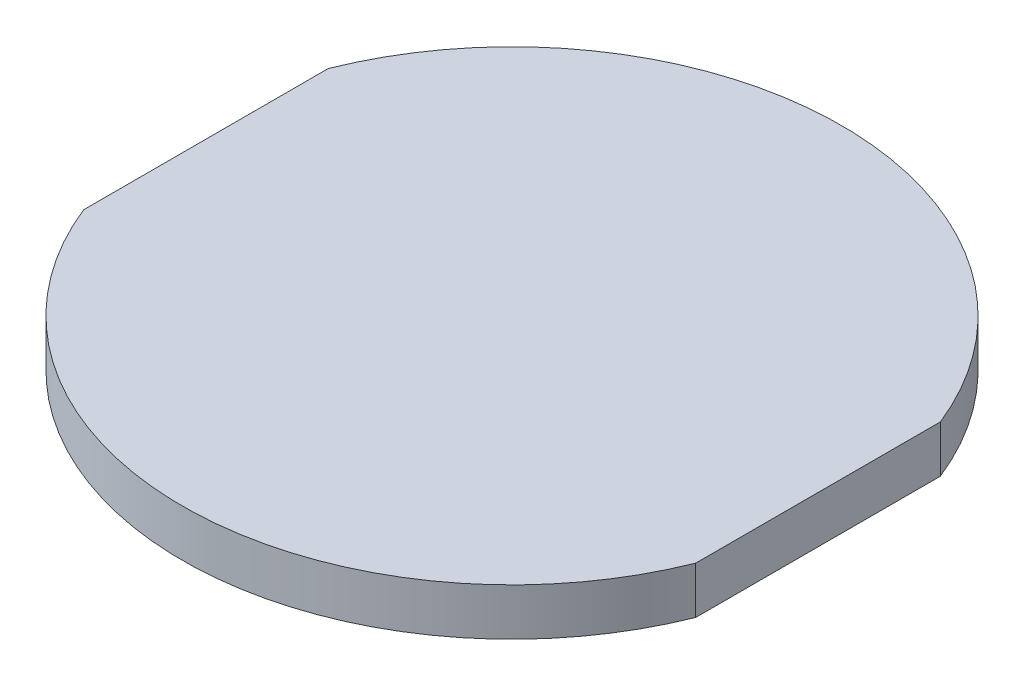
ISO-10303-21;
HEADER;
FILE_DESCRIPTION(('STEP AP214'),'2;1');
FILE_NAME('part.step','',(''),(''),'','','');
FILE_SCHEMA(('AUTOMOTIVE_DESIGN { 1 0 10303 214 1 1 1 1 }'));
ENDSEC;
DATA;
#1=APPLICATION_CONTEXT('core data for automotive mechanical design processes');
#2=APPLICATION_PROTOCOL_DEFINITION('international standard','automotive_design',2000,#1);
#3=PRODUCT_CONTEXT('',#1,'mechanical');
#4=PRODUCT('Part','Part','',(#3));
#5=PRODUCT_RELATED_PRODUCT_CATEGORY('part','',(#4));
#6=PRODUCT_DEFINITION_FORMATION('','',#4);
#7=PRODUCT_DEFINITION_CONTEXT('part definition',#1,'design');
#8=PRODUCT_DEFINITION('design','',#6,#7);
#9=PRODUCT_DEFINITION_SHAPE('','',#8);
#10=(LENGTH_UNIT() NAMED_UNIT(*) SI_UNIT(.MILLI.,.METRE.));
#11=(NAMED_UNIT(*) PLANE_ANGLE_UNIT() SI_UNIT($,.RADIAN.));
#12=(NAMED_UNIT(*) SI_UNIT($,.STERADIAN.) SOLID_ANGLE_UNIT());
#13=UNCERTAINTY_MEASURE_WITH_UNIT(LENGTH_MEASURE(1.E-05),#10,'distance_accuracy_value','');
#14=(GEOMETRIC_REPRESENTATION_CONTEXT(3) GLOBAL_UNCERTAINTY_ASSIGNED_CONTEXT((#13)) GLOBAL_UNIT_ASSIGNED_CONTEXT((#10,
#11,#12)) REPRESENTATION_CONTEXT('',''));
#15=CARTESIAN_POINT('',(0.,0.,0.));
#16=DIRECTION('',(0.,0.,1.));
#17=DIRECTION('',(1.,0.,0.));
#18=AXIS2_PLACEMENT_3D('',#15,#16,#17);
#19=CARTESIAN_POINT('',(0.,1.,0.));
#20=DIRECTION('',(0.,-1.,0.));
#21=DIRECTION('',(0.,0.,-1.));
#22=AXIS2_PLACEMENT_3D('',#19,#20,#21);
#23=CYLINDRICAL_SURFACE('',#22,7.);
#24=CARTESIAN_POINT('',(0.,0.,0.));
#25=DIRECTION('',(0.,1.,0.));
#26=DIRECTION('',(0.,0.,1.));
#27=AXIS2_PLACEMENT_3D('',#24,#25,#26);
#28=CIRCLE('',#27,7.);
#29=CARTESIAN_POINT('',(6.5,0.,-2.59807621135331));
#30=VERTEX_POINT('',#29);
#31=CARTESIAN_POINT('',(-6.5,0.,-2.59807621135332));
#32=VERTEX_POINT('',#31);
#33=EDGE_CURVE('E96',#30,#32,#28,.T.);
#34=ORIENTED_EDGE('',*,*,#33,.T.);
#35=DIRECTION('',(0.,-1.,0.));
#36=VECTOR('',#35,1.);
#37=CARTESIAN_POINT('',(-6.5,1.,-2.59807621135332));
#38=LINE('',#37,#36);
#39=CARTESIAN_POINT('',(-6.5,1.,-2.59807621135332));
#40=VERTEX_POINT('',#39);
#41=EDGE_CURVE('E11',#40,#32,#38,.T.);
#42=ORIENTED_EDGE('',*,*,#41,.F.);
#43=CARTESIAN_POINT('',(0.,1.,0.));
#44=DIRECTION('',(0.,1.,0.));
#45=DIRECTION('',(0.,0.,1.));
#46=AXIS2_PLACEMENT_3D('',#43,#44,#45);
#47=CIRCLE('',#46,7.);
#48=CARTESIAN_POINT('',(6.5,1.,-2.59807621135331));
#49=VERTEX_POINT('',#48);
#50=EDGE_CURVE('E84',#49,#40,#47,.T.);
#51=ORIENTED_EDGE('',*,*,#50,.F.);
#52=DIRECTION('',(0.,-1.,0.));
#53=VECTOR('',#52,1.);
#54=CARTESIAN_POINT('',(6.5,1.,-2.59807621135331));
#55=LINE('',#54,#53);
#56=EDGE_CURVE('E92',#49,#30,#55,.T.);
#57=ORIENTED_EDGE('',*,*,#56,.T.);
#58=EDGE_LOOP('',(#34,#42,#51,#57));
#59=FACE_BOUND('',#58,.T.);
#60=ADVANCED_FACE('F33',(#59),#23,.T.);
#61=CARTESIAN_POINT('',(-6.5,1.,-2.59807621135332));
#62=DIRECTION('',(1.,0.,0.));
#63=DIRECTION('',(0.,0.,-1.));
#64=AXIS2_PLACEMENT_3D('',#61,#62,#63);
#65=PLANE('',#64);
#66=DIRECTION('',(0.,0.,1.));
#67=VECTOR('',#66,1.);
#68=CARTESIAN_POINT('',(-6.5,0.,-2.59807621135332));
#69=LINE('',#68,#67);
#70=CARTESIAN_POINT('',(-6.5,0.,2.59807621135332));
#71=VERTEX_POINT('',#70);
#72=EDGE_CURVE('E88',#32,#71,#69,.T.);
#73=ORIENTED_EDGE('',*,*,#72,.T.);
#74=DIRECTION('',(0.,-1.,0.));
#75=VECTOR('',#74,1.);
#76=CARTESIAN_POINT('',(-6.5,1.,2.59807621135332));
#77=LINE('',#76,#75);
#78=CARTESIAN_POINT('',(-6.5,1.,2.59807621135332));
#79=VERTEX_POINT('',#78);
#80=EDGE_CURVE('E41',#79,#71,#77,.T.);
#81=ORIENTED_EDGE('',*,*,#80,.F.);
#82=DIRECTION('',(0.,0.,1.));
#83=VECTOR('',#82,1.);
#84=CARTESIAN_POINT('',(-6.5,1.,-2.59807621135332));
#85=LINE('',#84,#83);
#86=EDGE_CURVE('E79',#40,#79,#85,.T.);
#87=ORIENTED_EDGE('',*,*,#86,.F.);
#88=ORIENTED_EDGE('',*,*,#41,.T.);
#89=EDGE_LOOP('',(#73,#81,#87,#88));
#90=FACE_BOUND('',#89,.T.);
#91=ADVANCED_FACE('F87',(#90),#65,.F.);
#92=CARTESIAN_POINT('',(0.,1.,0.));
#93=DIRECTION('',(0.,-1.,0.));
#94=DIRECTION('',(0.,0.,-1.));
#95=AXIS2_PLACEMENT_3D('',#92,#93,#94);
#96=CYLINDRICAL_SURFACE('',#95,7.);
#97=CARTESIAN_POINT('',(0.,0.,0.));
#98=DIRECTION('',(0.,1.,0.));
#99=DIRECTION('',(0.,0.,1.));
#100=AXIS2_PLACEMENT_3D('',#97,#98,#99);
#101=CIRCLE('',#100,7.);
#102=CARTESIAN_POINT('',(6.5,0.,2.59807621135331));
#103=VERTEX_POINT('',#102);
#104=EDGE_CURVE('E66',#71,#103,#101,.T.);
#105=ORIENTED_EDGE('',*,*,#104,.T.);
#106=DIRECTION('',(0.,-1.,0.));
#107=VECTOR('',#106,1.);
#108=CARTESIAN_POINT('',(6.5,1.,2.59807621135331));
#109=LINE('',#108,#107);
#110=CARTESIAN_POINT('',(6.5,1.,2.59807621135331));
#111=VERTEX_POINT('',#110);
#112=EDGE_CURVE('E89',#111,#103,#109,.T.);
#113=ORIENTED_EDGE('',*,*,#112,.F.);
#114=CARTESIAN_POINT('',(0.,1.,0.));
#115=DIRECTION('',(0.,1.,0.));
#116=DIRECTION('',(0.,0.,1.));
#117=AXIS2_PLACEMENT_3D('',#114,#115,#116);
#118=CIRCLE('',#117,7.);
#119=EDGE_CURVE('E82',#79,#111,#118,.T.);
#120=ORIENTED_EDGE('',*,*,#119,.F.);
#121=ORIENTED_EDGE('',*,*,#80,.T.);
#122=EDGE_LOOP('',(#105,#113,#120,#121));
#123=FACE_BOUND('',#122,.T.);
#124=ADVANCED_FACE('F90',(#123),#96,.T.);
#125=CARTESIAN_POINT('',(6.5,1.,-2.59807621135331));
#126=DIRECTION('',(-1.,0.,0.));
#127=DIRECTION('',(0.,0.,1.));
#128=AXIS2_PLACEMENT_3D('',#125,#126,#127);
#129=PLANE('',#128);
#130=DIRECTION('',(0.,0.,-1.));
#131=VECTOR('',#130,1.);
#132=CARTESIAN_POINT('',(6.5,0.,-2.59807621135331));
#133=LINE('',#132,#131);
#134=EDGE_CURVE('E72',#103,#30,#133,.T.);
#135=ORIENTED_EDGE('',*,*,#134,.T.);
#136=ORIENTED_EDGE('',*,*,#56,.F.);
#137=DIRECTION('',(0.,0.,-1.));
#138=VECTOR('',#137,1.);
#139=CARTESIAN_POINT('',(6.5,1.,-2.59807621135331));
#140=LINE('',#139,#138);
#141=EDGE_CURVE('E49',#111,#49,#140,.T.);
#142=ORIENTED_EDGE('',*,*,#141,.F.);
#143=ORIENTED_EDGE('',*,*,#112,.T.);
#144=EDGE_LOOP('',(#135,#136,#142,#143));
#145=FACE_BOUND('',#144,.T.);
#146=ADVANCED_FACE('F103',(#145),#129,.F.);
#147=CARTESIAN_POINT('',(0.,1.,0.));
#148=DIRECTION('',(0.,1.,0.));
#149=DIRECTION('',(0.,0.,1.));
#150=AXIS2_PLACEMENT_3D('',#147,#148,#149);
#151=PLANE('',#150);
#152=ORIENTED_EDGE('',*,*,#50,.T.);
#153=ORIENTED_EDGE('',*,*,#86,.T.);
#154=ORIENTED_EDGE('',*,*,#119,.T.);
#155=ORIENTED_EDGE('',*,*,#141,.T.);
#156=EDGE_LOOP('',(#152,#153,#154,#155));
#157=FACE_BOUND('',#156,.T.);
#158=ADVANCED_FACE('F80',(#157),#151,.T.);
#159=CARTESIAN_POINT('',(0.,0.,0.));
#160=DIRECTION('',(0.,1.,0.));
#161=DIRECTION('',(0.,0.,1.));
#162=AXIS2_PLACEMENT_3D('',#159,#160,#161);
#163=PLANE('',#162);
#164=ORIENTED_EDGE('',*,*,#33,.F.);
#165=ORIENTED_EDGE('',*,*,#134,.F.);
#166=ORIENTED_EDGE('',*,*,#104,.F.);
#167=ORIENTED_EDGE('',*,*,#72,.F.);
#168=EDGE_LOOP('',(#164,#165,#166,#167));
#169=FACE_BOUND('',#168,.T.);
#170=ADVANCED_FACE('F106',(#169),#163,.F.);
#171=CLOSED_SHELL('',(#60,#91,#124,#146,#158,#170));
#172=MANIFOLD_SOLID_BREP('B2',#171);
#173=ADVANCED_BREP_SHAPE_REPRESENTATION('',(#18,#172),#14);
#174=SHAPE_DEFINITION_REPRESENTATION(#9,#173);
ENDSEC;
END-ISO-10303-21;
